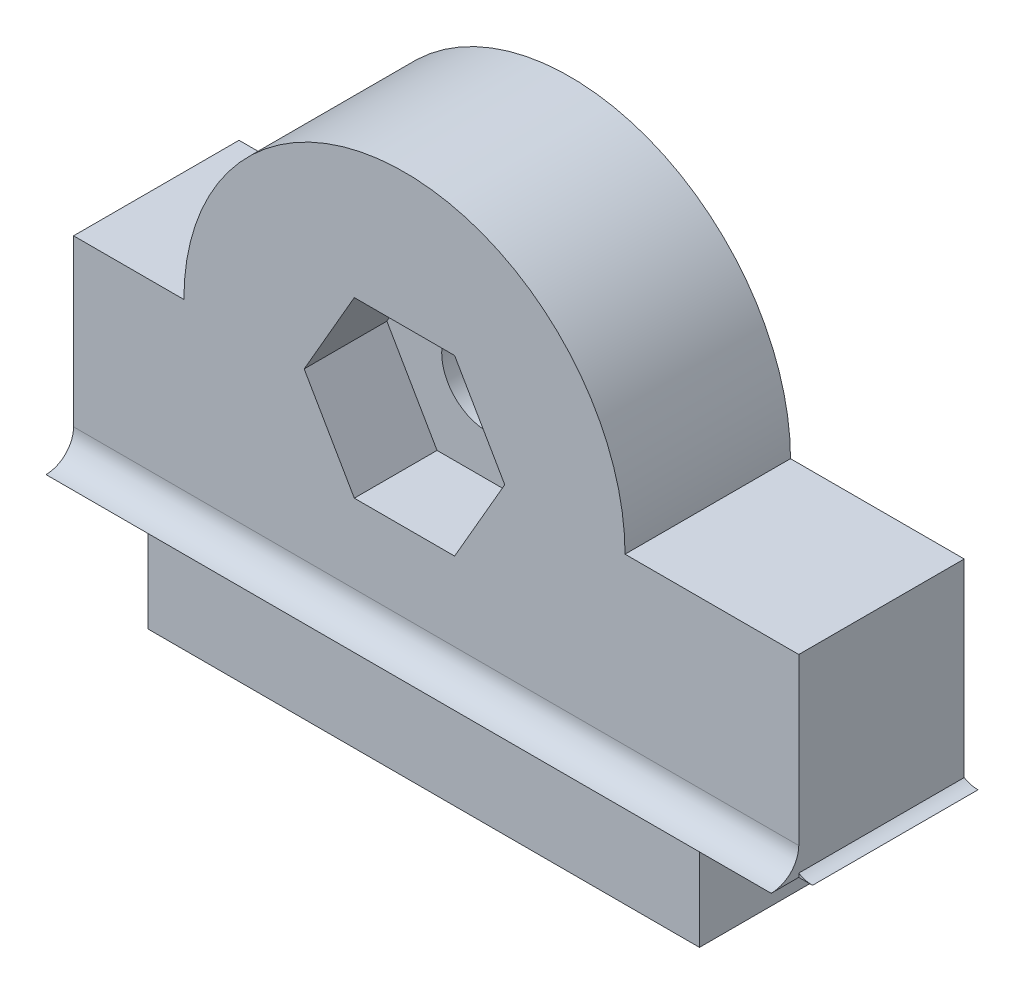
ISO-10303-21;
HEADER;
FILE_DESCRIPTION(('STEP AP214'),'2;1');
FILE_NAME('part.step','',(''),(''),'','','');
FILE_SCHEMA(('AUTOMOTIVE_DESIGN { 1 0 10303 214 1 1 1 1 }'));
ENDSEC;
DATA;
#1=APPLICATION_CONTEXT('core data for automotive mechanical design processes');
#2=APPLICATION_PROTOCOL_DEFINITION('international standard','automotive_design',2000,#1);
#3=PRODUCT_CONTEXT('',#1,'mechanical');
#4=PRODUCT('Part','Part','',(#3));
#5=PRODUCT_RELATED_PRODUCT_CATEGORY('part','',(#4));
#6=PRODUCT_DEFINITION_FORMATION('','',#4);
#7=PRODUCT_DEFINITION_CONTEXT('part definition',#1,'design');
#8=PRODUCT_DEFINITION('design','',#6,#7);
#9=PRODUCT_DEFINITION_SHAPE('','',#8);
#10=(LENGTH_UNIT() NAMED_UNIT(*) SI_UNIT(.MILLI.,.METRE.));
#11=(NAMED_UNIT(*) PLANE_ANGLE_UNIT() SI_UNIT($,.RADIAN.));
#12=(NAMED_UNIT(*) SI_UNIT($,.STERADIAN.) SOLID_ANGLE_UNIT());
#13=UNCERTAINTY_MEASURE_WITH_UNIT(LENGTH_MEASURE(1.E-05),#10,'distance_accuracy_value','');
#14=(GEOMETRIC_REPRESENTATION_CONTEXT(3) GLOBAL_UNCERTAINTY_ASSIGNED_CONTEXT((#13)) GLOBAL_UNIT_ASSIGNED_CONTEXT((#10,
#11,#12)) REPRESENTATION_CONTEXT('',''));
#15=CARTESIAN_POINT('',(0.,0.,0.));
#16=DIRECTION('',(0.,0.,1.));
#17=DIRECTION('',(1.,0.,0.));
#18=AXIS2_PLACEMENT_3D('',#15,#16,#17);
#19=CARTESIAN_POINT('',(12.9373066958946,11.,6.));
#20=DIRECTION('',(-0.866025403784439,-0.5,0.));
#21=DIRECTION('',(0.5,-0.866025403784439,0.));
#22=AXIS2_PLACEMENT_3D('',#19,#20,#21);
#23=PLANE('',#22);
#24=DIRECTION('',(0.,0.,-1.));
#25=VECTOR('',#24,1.);
#26=CARTESIAN_POINT('',(11.1186533479473,14.15,6.));
#27=LINE('',#26,#25);
#28=CARTESIAN_POINT('',(11.1186533479473,14.15,6.));
#29=VERTEX_POINT('',#28);
#30=CARTESIAN_POINT('',(11.1186533479473,14.15,3.));
#31=VERTEX_POINT('',#30);
#32=EDGE_CURVE('E181',#29,#31,#27,.T.);
#33=ORIENTED_EDGE('',*,*,#32,.T.);
#34=DIRECTION('',(0.499999999999999,-0.866025403784439,0.));
#35=VECTOR('',#34,1.);
#36=CARTESIAN_POINT('',(11.1186533479473,14.15,3.));
#37=LINE('',#36,#35);
#38=CARTESIAN_POINT('',(12.9373066958946,11.,3.));
#39=VERTEX_POINT('',#38);
#40=EDGE_CURVE('E170',#31,#39,#37,.T.);
#41=ORIENTED_EDGE('',*,*,#40,.T.);
#42=DIRECTION('',(0.,0.,-1.));
#43=VECTOR('',#42,1.);
#44=CARTESIAN_POINT('',(12.9373066958946,11.,6.));
#45=LINE('',#44,#43);
#46=CARTESIAN_POINT('',(12.9373066958946,11.,6.));
#47=VERTEX_POINT('',#46);
#48=EDGE_CURVE('E286',#47,#39,#45,.T.);
#49=ORIENTED_EDGE('',*,*,#48,.F.);
#50=DIRECTION('',(-0.5,0.866025403784439,0.));
#51=VECTOR('',#50,1.);
#52=CARTESIAN_POINT('',(12.9373066958946,11.,6.));
#53=LINE('',#52,#51);
#54=EDGE_CURVE('E186',#47,#29,#53,.T.);
#55=ORIENTED_EDGE('',*,*,#54,.T.);
#56=EDGE_LOOP('',(#33,#41,#49,#55));
#57=FACE_BOUND('',#56,.T.);
#58=ADVANCED_FACE('F33',(#57),#23,.T.);
#59=CARTESIAN_POINT('',(11.1186533479473,14.15,6.));
#60=DIRECTION('',(0.,-1.,0.));
#61=DIRECTION('',(1.,0.,0.));
#62=AXIS2_PLACEMENT_3D('',#59,#60,#61);
#63=PLANE('',#62);
#64=DIRECTION('',(0.,0.,-1.));
#65=VECTOR('',#64,1.);
#66=CARTESIAN_POINT('',(7.48134665205268,14.15,6.));
#67=LINE('',#66,#65);
#68=CARTESIAN_POINT('',(7.48134665205267,14.15,6.));
#69=VERTEX_POINT('',#68);
#70=CARTESIAN_POINT('',(7.48134665205266,14.15,3.));
#71=VERTEX_POINT('',#70);
#72=EDGE_CURVE('E56',#69,#71,#67,.T.);
#73=ORIENTED_EDGE('',*,*,#72,.T.);
#74=DIRECTION('',(1.,0.,0.));
#75=VECTOR('',#74,1.);
#76=CARTESIAN_POINT('',(7.48134665205266,14.15,3.));
#77=LINE('',#76,#75);
#78=EDGE_CURVE('E173',#71,#31,#77,.T.);
#79=ORIENTED_EDGE('',*,*,#78,.T.);
#80=ORIENTED_EDGE('',*,*,#32,.F.);
#81=DIRECTION('',(-1.,0.,0.));
#82=VECTOR('',#81,1.);
#83=CARTESIAN_POINT('',(11.1186533479473,14.15,6.));
#84=LINE('',#83,#82);
#85=EDGE_CURVE('E319',#29,#69,#84,.T.);
#86=ORIENTED_EDGE('',*,*,#85,.T.);
#87=EDGE_LOOP('',(#73,#79,#80,#86));
#88=FACE_BOUND('',#87,.T.);
#89=ADVANCED_FACE('F180',(#88),#63,.T.);
#90=CARTESIAN_POINT('',(7.48134665205268,14.15,6.));
#91=DIRECTION('',(0.866025403784439,-0.5,0.));
#92=DIRECTION('',(0.5,0.866025403784439,0.));
#93=AXIS2_PLACEMENT_3D('',#90,#91,#92);
#94=PLANE('',#93);
#95=DIRECTION('',(0.,0.,-1.));
#96=VECTOR('',#95,1.);
#97=CARTESIAN_POINT('',(5.66269330410536,11.,6.));
#98=LINE('',#97,#96);
#99=CARTESIAN_POINT('',(5.66269330410534,11.,6.));
#100=VERTEX_POINT('',#99);
#101=CARTESIAN_POINT('',(5.66269330410534,11.,3.));
#102=VERTEX_POINT('',#101);
#103=EDGE_CURVE('E193',#100,#102,#98,.T.);
#104=ORIENTED_EDGE('',*,*,#103,.T.);
#105=DIRECTION('',(0.5,0.866025403784438,0.));
#106=VECTOR('',#105,1.);
#107=CARTESIAN_POINT('',(5.66269330410534,11.,3.));
#108=LINE('',#107,#106);
#109=EDGE_CURVE('E307',#102,#71,#108,.T.);
#110=ORIENTED_EDGE('',*,*,#109,.T.);
#111=ORIENTED_EDGE('',*,*,#72,.F.);
#112=DIRECTION('',(-0.5,-0.866025403784439,0.));
#113=VECTOR('',#112,1.);
#114=CARTESIAN_POINT('',(7.48134665205267,14.15,6.));
#115=LINE('',#114,#113);
#116=EDGE_CURVE('E309',#69,#100,#115,.T.);
#117=ORIENTED_EDGE('',*,*,#116,.T.);
#118=EDGE_LOOP('',(#104,#110,#111,#117));
#119=FACE_BOUND('',#118,.T.);
#120=ADVANCED_FACE('F306',(#119),#94,.T.);
#121=CARTESIAN_POINT('',(5.66269330410536,11.,6.));
#122=DIRECTION('',(0.866025403784438,0.5,0.));
#123=DIRECTION('',(-0.5,0.866025403784439,0.));
#124=AXIS2_PLACEMENT_3D('',#121,#122,#123);
#125=PLANE('',#124);
#126=DIRECTION('',(0.,0.,-1.));
#127=VECTOR('',#126,1.);
#128=CARTESIAN_POINT('',(7.48134665205267,7.85000000000002,6.));
#129=LINE('',#128,#127);
#130=CARTESIAN_POINT('',(7.48134665205267,7.85,6.));
#131=VERTEX_POINT('',#130);
#132=CARTESIAN_POINT('',(7.48134665205266,7.85,3.));
#133=VERTEX_POINT('',#132);
#134=EDGE_CURVE('E303',#131,#133,#129,.T.);
#135=ORIENTED_EDGE('',*,*,#134,.T.);
#136=DIRECTION('',(-0.5,0.866025403784439,0.));
#137=VECTOR('',#136,1.);
#138=CARTESIAN_POINT('',(7.48134665205266,7.85,3.));
#139=LINE('',#138,#137);
#140=EDGE_CURVE('E317',#133,#102,#139,.T.);
#141=ORIENTED_EDGE('',*,*,#140,.T.);
#142=ORIENTED_EDGE('',*,*,#103,.F.);
#143=DIRECTION('',(0.5,-0.866025403784439,0.));
#144=VECTOR('',#143,1.);
#145=CARTESIAN_POINT('',(5.66269330410534,11.,6.));
#146=LINE('',#145,#144);
#147=EDGE_CURVE('E315',#100,#131,#146,.T.);
#148=ORIENTED_EDGE('',*,*,#147,.T.);
#149=EDGE_LOOP('',(#135,#141,#142,#148));
#150=FACE_BOUND('',#149,.T.);
#151=ADVANCED_FACE('F314',(#150),#125,.T.);
#152=CARTESIAN_POINT('',(7.48134665205267,7.85000000000002,6.));
#153=DIRECTION('',(0.,1.,0.));
#154=DIRECTION('',(-1.,0.,0.));
#155=AXIS2_PLACEMENT_3D('',#152,#153,#154);
#156=PLANE('',#155);
#157=DIRECTION('',(0.,0.,-1.));
#158=VECTOR('',#157,1.);
#159=CARTESIAN_POINT('',(11.1186533479473,7.85000000000001,6.));
#160=LINE('',#159,#158);
#161=CARTESIAN_POINT('',(11.1186533479473,7.85,6.));
#162=VERTEX_POINT('',#161);
#163=CARTESIAN_POINT('',(11.1186533479473,7.85000000000001,3.));
#164=VERTEX_POINT('',#163);
#165=EDGE_CURVE('E300',#162,#164,#160,.T.);
#166=ORIENTED_EDGE('',*,*,#165,.T.);
#167=DIRECTION('',(-1.,0.,0.));
#168=VECTOR('',#167,1.);
#169=CARTESIAN_POINT('',(11.1186533479473,7.84999999999999,3.));
#170=LINE('',#169,#168);
#171=EDGE_CURVE('E48',#164,#133,#170,.T.);
#172=ORIENTED_EDGE('',*,*,#171,.T.);
#173=ORIENTED_EDGE('',*,*,#134,.F.);
#174=DIRECTION('',(1.,0.,0.));
#175=VECTOR('',#174,1.);
#176=CARTESIAN_POINT('',(7.48134665205267,7.85,6.));
#177=LINE('',#176,#175);
#178=EDGE_CURVE('E327',#131,#162,#177,.T.);
#179=ORIENTED_EDGE('',*,*,#178,.T.);
#180=EDGE_LOOP('',(#166,#172,#173,#179));
#181=FACE_BOUND('',#180,.T.);
#182=ADVANCED_FACE('F435',(#181),#156,.T.);
#183=CARTESIAN_POINT('',(11.1186533479473,7.85000000000001,6.));
#184=DIRECTION('',(-0.866025403784439,0.5,0.));
#185=DIRECTION('',(-0.5,-0.866025403784439,0.));
#186=AXIS2_PLACEMENT_3D('',#183,#184,#185);
#187=PLANE('',#186);
#188=ORIENTED_EDGE('',*,*,#48,.T.);
#189=DIRECTION('',(-0.5,-0.866025403784438,0.));
#190=VECTOR('',#189,1.);
#191=CARTESIAN_POINT('',(12.9373066958946,11.,3.));
#192=LINE('',#191,#190);
#193=EDGE_CURVE('E174',#39,#164,#192,.T.);
#194=ORIENTED_EDGE('',*,*,#193,.T.);
#195=ORIENTED_EDGE('',*,*,#165,.F.);
#196=DIRECTION('',(0.499999999999999,0.866025403784439,0.));
#197=VECTOR('',#196,1.);
#198=CARTESIAN_POINT('',(11.1186533479473,7.85,6.));
#199=LINE('',#198,#197);
#200=EDGE_CURVE('E330',#162,#47,#199,.T.);
#201=ORIENTED_EDGE('',*,*,#200,.T.);
#202=EDGE_LOOP('',(#188,#194,#195,#201));
#203=FACE_BOUND('',#202,.T.);
#204=ADVANCED_FACE('F432',(#203),#187,.T.);
#205=CARTESIAN_POINT('',(9.29999999999998,11.,6.));
#206=DIRECTION('',(0.,0.,1.));
#207=DIRECTION('',(1.,0.,0.));
#208=AXIS2_PLACEMENT_3D('',#205,#206,#207);
#209=PLANE('',#208);
#210=ORIENTED_EDGE('',*,*,#85,.F.);
#211=ORIENTED_EDGE('',*,*,#54,.F.);
#212=ORIENTED_EDGE('',*,*,#200,.F.);
#213=ORIENTED_EDGE('',*,*,#178,.F.);
#214=ORIENTED_EDGE('',*,*,#147,.F.);
#215=ORIENTED_EDGE('',*,*,#116,.F.);
#216=EDGE_LOOP('',(#210,#211,#212,#213,#214,#215));
#217=FACE_BOUND('',#216,.T.);
#218=DIRECTION('',(0.,-1.,0.));
#219=VECTOR('',#218,1.);
#220=CARTESIAN_POINT('',(-2.7,4.,6.));
#221=LINE('',#220,#219);
#222=CARTESIAN_POINT('',(-2.7,11.,6.));
#223=VERTEX_POINT('',#222);
#224=CARTESIAN_POINT('',(-2.7,5.,6.));
#225=VERTEX_POINT('',#224);
#226=EDGE_CURVE('E213',#223,#225,#221,.T.);
#227=ORIENTED_EDGE('',*,*,#226,.T.);
#228=DIRECTION('',(-1.,0.,0.));
#229=VECTOR('',#228,1.);
#230=CARTESIAN_POINT('',(25.0142135623731,5.,6.));
#231=LINE('',#230,#229);
#232=CARTESIAN_POINT('',(-1.49999999999999,5.,6.));
#233=VERTEX_POINT('',#232);
#234=EDGE_CURVE('E291',#233,#225,#231,.T.);
#235=ORIENTED_EDGE('',*,*,#234,.F.);
#236=CARTESIAN_POINT('',(23.1,5.,6.));
#237=VERTEX_POINT('',#236);
#238=EDGE_CURVE('E289',#237,#233,#231,.T.);
#239=ORIENTED_EDGE('',*,*,#238,.F.);
#240=CARTESIAN_POINT('',(23.6,5.,6.));
#241=VERTEX_POINT('',#240);
#242=EDGE_CURVE('E283',#241,#237,#231,.T.);
#243=ORIENTED_EDGE('',*,*,#242,.F.);
#244=DIRECTION('',(0.,1.,0.));
#245=VECTOR('',#244,1.);
#246=CARTESIAN_POINT('',(23.6,11.,6.));
#247=LINE('',#246,#245);
#248=CARTESIAN_POINT('',(23.6,11.,6.));
#249=VERTEX_POINT('',#248);
#250=EDGE_CURVE('E205',#241,#249,#247,.T.);
#251=ORIENTED_EDGE('',*,*,#250,.T.);
#252=DIRECTION('',(-1.,0.,0.));
#253=VECTOR('',#252,1.);
#254=CARTESIAN_POINT('',(17.3,11.,6.));
#255=LINE('',#254,#253);
#256=CARTESIAN_POINT('',(17.3,11.,6.));
#257=VERTEX_POINT('',#256);
#258=EDGE_CURVE('E207',#249,#257,#255,.T.);
#259=ORIENTED_EDGE('',*,*,#258,.T.);
#260=CARTESIAN_POINT('',(9.29999999999998,11.,6.));
#261=DIRECTION('',(0.,0.,1.));
#262=DIRECTION('',(1.,0.,0.));
#263=AXIS2_PLACEMENT_3D('',#260,#261,#262);
#264=CIRCLE('',#263,8.00000000000001);
#265=CARTESIAN_POINT('',(1.29999999999998,11.,6.));
#266=VERTEX_POINT('',#265);
#267=EDGE_CURVE('E209',#257,#266,#264,.T.);
#268=ORIENTED_EDGE('',*,*,#267,.T.);
#269=DIRECTION('',(-1.,0.,0.));
#270=VECTOR('',#269,1.);
#271=CARTESIAN_POINT('',(-2.7,11.,6.));
#272=LINE('',#271,#270);
#273=EDGE_CURVE('E211',#266,#223,#272,.T.);
#274=ORIENTED_EDGE('',*,*,#273,.T.);
#275=EDGE_LOOP('',(#227,#235,#239,#243,#251,#259,#268,#274));
#276=FACE_BOUND('',#275,.T.);
#277=ADVANCED_FACE('F357',(#217,#276),#209,.T.);
#278=DIRECTION('',(-1.,0.,0.));
#279=VECTOR('',#278,1.);
#280=CARTESIAN_POINT('',(25.0142135623731,4.,6.));
#281=LINE('',#280,#279);
#282=CARTESIAN_POINT('',(20.,4.,6.));
#283=VERTEX_POINT('',#282);
#284=CARTESIAN_POINT('',(0.,4.,6.));
#285=VERTEX_POINT('',#284);
#286=EDGE_CURVE('E280',#283,#285,#281,.T.);
#287=ORIENTED_EDGE('',*,*,#286,.T.);
#288=DIRECTION('',(0.,-1.,0.));
#289=VECTOR('',#288,1.);
#290=CARTESIAN_POINT('',(0.,0.,6.));
#291=LINE('',#290,#289);
#292=CARTESIAN_POINT('',(0.,0.,6.));
#293=VERTEX_POINT('',#292);
#294=EDGE_CURVE('E197',#285,#293,#291,.T.);
#295=ORIENTED_EDGE('',*,*,#294,.T.);
#296=DIRECTION('',(1.,0.,0.));
#297=VECTOR('',#296,1.);
#298=CARTESIAN_POINT('',(0.,0.,6.));
#299=LINE('',#298,#297);
#300=CARTESIAN_POINT('',(20.,0.,6.));
#301=VERTEX_POINT('',#300);
#302=EDGE_CURVE('E200',#293,#301,#299,.T.);
#303=ORIENTED_EDGE('',*,*,#302,.T.);
#304=DIRECTION('',(0.,1.,0.));
#305=VECTOR('',#304,1.);
#306=CARTESIAN_POINT('',(20.,0.,6.));
#307=LINE('',#306,#305);
#308=EDGE_CURVE('E203',#301,#283,#307,.T.);
#309=ORIENTED_EDGE('',*,*,#308,.T.);
#310=EDGE_LOOP('',(#287,#295,#303,#309));
#311=FACE_BOUND('',#310,.T.);
#312=ADVANCED_FACE('F370',(#311),#209,.T.);
#313=CARTESIAN_POINT('',(9.29999999999998,11.,0.));
#314=DIRECTION('',(0.,0.,1.));
#315=DIRECTION('',(1.,0.,0.));
#316=AXIS2_PLACEMENT_3D('',#313,#314,#315);
#317=PLANE('',#316);
#318=DIRECTION('',(0.,-1.,0.));
#319=VECTOR('',#318,1.);
#320=CARTESIAN_POINT('',(0.,0.,0.));
#321=LINE('',#320,#319);
#322=CARTESIAN_POINT('',(0.,4.,0.));
#323=VERTEX_POINT('',#322);
#324=CARTESIAN_POINT('',(0.,0.,0.));
#325=VERTEX_POINT('',#324);
#326=EDGE_CURVE('E188',#323,#325,#321,.T.);
#327=ORIENTED_EDGE('',*,*,#326,.F.);
#328=DIRECTION('',(1.,0.,0.));
#329=VECTOR('',#328,1.);
#330=CARTESIAN_POINT('',(0.,4.,0.));
#331=LINE('',#330,#329);
#332=CARTESIAN_POINT('',(-2.7,4.,0.));
#333=VERTEX_POINT('',#332);
#334=EDGE_CURVE('E201',#333,#323,#331,.T.);
#335=ORIENTED_EDGE('',*,*,#334,.F.);
#336=DIRECTION('',(0.,-1.,0.));
#337=VECTOR('',#336,1.);
#338=CARTESIAN_POINT('',(-2.7,4.,0.));
#339=LINE('',#338,#337);
#340=CARTESIAN_POINT('',(-2.7,11.,0.));
#341=VERTEX_POINT('',#340);
#342=EDGE_CURVE('E230',#341,#333,#339,.T.);
#343=ORIENTED_EDGE('',*,*,#342,.F.);
#344=DIRECTION('',(-1.,0.,0.));
#345=VECTOR('',#344,1.);
#346=CARTESIAN_POINT('',(-2.7,11.,0.));
#347=LINE('',#346,#345);
#348=CARTESIAN_POINT('',(1.29999999999998,11.,0.));
#349=VERTEX_POINT('',#348);
#350=EDGE_CURVE('E228',#349,#341,#347,.T.);
#351=ORIENTED_EDGE('',*,*,#350,.F.);
#352=CARTESIAN_POINT('',(9.29999999999998,11.,0.));
#353=DIRECTION('',(0.,0.,1.));
#354=DIRECTION('',(1.,0.,0.));
#355=AXIS2_PLACEMENT_3D('',#352,#353,#354);
#356=CIRCLE('',#355,8.00000000000001);
#357=CARTESIAN_POINT('',(17.3,11.,0.));
#358=VERTEX_POINT('',#357);
#359=EDGE_CURVE('E226',#358,#349,#356,.T.);
#360=ORIENTED_EDGE('',*,*,#359,.F.);
#361=DIRECTION('',(-1.,0.,0.));
#362=VECTOR('',#361,1.);
#363=CARTESIAN_POINT('',(17.3,11.,0.));
#364=LINE('',#363,#362);
#365=CARTESIAN_POINT('',(23.6,11.,0.));
#366=VERTEX_POINT('',#365);
#367=EDGE_CURVE('E224',#366,#358,#364,.T.);
#368=ORIENTED_EDGE('',*,*,#367,.F.);
#369=DIRECTION('',(0.,1.,0.));
#370=VECTOR('',#369,1.);
#371=CARTESIAN_POINT('',(23.6,11.,0.));
#372=LINE('',#371,#370);
#373=CARTESIAN_POINT('',(23.6,4.13397459621556,0.));
#374=VERTEX_POINT('',#373);
#375=EDGE_CURVE('E222',#374,#366,#372,.T.);
#376=ORIENTED_EDGE('',*,*,#375,.F.);
#377=CARTESIAN_POINT('',(24.1,5.,0.));
#378=DIRECTION('',(0.,0.,1.));
#379=DIRECTION('',(1.,0.,0.));
#380=AXIS2_PLACEMENT_3D('',#377,#378,#379);
#381=CIRCLE('',#380,1.);
#382=CARTESIAN_POINT('',(24.1,4.,0.));
#383=VERTEX_POINT('',#382);
#384=EDGE_CURVE('E269',#374,#383,#381,.T.);
#385=ORIENTED_EDGE('',*,*,#384,.T.);
#386=DIRECTION('',(1.,0.,0.));
#387=VECTOR('',#386,1.);
#388=CARTESIAN_POINT('',(23.6,4.,0.));
#389=LINE('',#388,#387);
#390=CARTESIAN_POINT('',(20.,4.,0.));
#391=VERTEX_POINT('',#390);
#392=EDGE_CURVE('E220',#391,#383,#389,.T.);
#393=ORIENTED_EDGE('',*,*,#392,.F.);
#394=DIRECTION('',(0.,1.,0.));
#395=VECTOR('',#394,1.);
#396=CARTESIAN_POINT('',(20.,0.,0.));
#397=LINE('',#396,#395);
#398=CARTESIAN_POINT('',(20.,0.,0.));
#399=VERTEX_POINT('',#398);
#400=EDGE_CURVE('E218',#399,#391,#397,.T.);
#401=ORIENTED_EDGE('',*,*,#400,.F.);
#402=DIRECTION('',(1.,0.,0.));
#403=VECTOR('',#402,1.);
#404=CARTESIAN_POINT('',(0.,0.,0.));
#405=LINE('',#404,#403);
#406=EDGE_CURVE('E191',#325,#399,#405,.T.);
#407=ORIENTED_EDGE('',*,*,#406,.F.);
#408=EDGE_LOOP('',(#327,#335,#343,#351,#360,#368,#376,#385,#393,#401,#407));
#409=FACE_BOUND('',#408,.T.);
#410=CARTESIAN_POINT('',(9.29999999999998,11.,0.));
#411=DIRECTION('',(0.,0.,-1.));
#412=DIRECTION('',(-1.,0.,0.));
#413=AXIS2_PLACEMENT_3D('',#410,#411,#412);
#414=CIRCLE('',#413,1.65);
#415=CARTESIAN_POINT('',(7.64999999999999,11.,0.));
#416=VERTEX_POINT('',#415);
#417=EDGE_CURVE('E620',#416,#416,#414,.T.);
#418=ORIENTED_EDGE('',*,*,#417,.F.);
#419=EDGE_LOOP('',(#418));
#420=FACE_BOUND('',#419,.T.);
#421=ADVANCED_FACE('F265',(#409,#420),#317,.F.);
#422=CARTESIAN_POINT('',(0.,0.,6.));
#423=DIRECTION('',(1.,0.,0.));
#424=DIRECTION('',(0.,0.,-1.));
#425=AXIS2_PLACEMENT_3D('',#422,#423,#424);
#426=PLANE('',#425);
#427=ORIENTED_EDGE('',*,*,#326,.T.);
#428=DIRECTION('',(0.,0.,-1.));
#429=VECTOR('',#428,1.);
#430=CARTESIAN_POINT('',(0.,0.,6.));
#431=LINE('',#430,#429);
#432=EDGE_CURVE('E11',#293,#325,#431,.T.);
#433=ORIENTED_EDGE('',*,*,#432,.F.);
#434=ORIENTED_EDGE('',*,*,#294,.F.);
#435=DIRECTION('',(0.,0.,-1.));
#436=VECTOR('',#435,1.);
#437=CARTESIAN_POINT('',(0.,4.,6.));
#438=LINE('',#437,#436);
#439=EDGE_CURVE('E215',#285,#323,#438,.T.);
#440=ORIENTED_EDGE('',*,*,#439,.T.);
#441=EDGE_LOOP('',(#427,#433,#434,#440));
#442=FACE_BOUND('',#441,.T.);
#443=ADVANCED_FACE('F35',(#442),#426,.F.);
#444=CARTESIAN_POINT('',(0.,0.,6.));
#445=DIRECTION('',(0.,1.,0.));
#446=DIRECTION('',(0.,0.,1.));
#447=AXIS2_PLACEMENT_3D('',#444,#445,#446);
#448=PLANE('',#447);
#449=ORIENTED_EDGE('',*,*,#406,.T.);
#450=DIRECTION('',(0.,0.,-1.));
#451=VECTOR('',#450,1.);
#452=CARTESIAN_POINT('',(20.,0.,6.));
#453=LINE('',#452,#451);
#454=EDGE_CURVE('E41',#301,#399,#453,.T.);
#455=ORIENTED_EDGE('',*,*,#454,.F.);
#456=ORIENTED_EDGE('',*,*,#302,.F.);
#457=ORIENTED_EDGE('',*,*,#432,.T.);
#458=EDGE_LOOP('',(#449,#455,#456,#457));
#459=FACE_BOUND('',#458,.T.);
#460=ADVANCED_FACE('F371',(#459),#448,.F.);
#461=CARTESIAN_POINT('',(20.,0.,6.));
#462=DIRECTION('',(-1.,0.,0.));
#463=DIRECTION('',(0.,0.,1.));
#464=AXIS2_PLACEMENT_3D('',#461,#462,#463);
#465=PLANE('',#464);
#466=ORIENTED_EDGE('',*,*,#400,.T.);
#467=DIRECTION('',(0.,0.,-1.));
#468=VECTOR('',#467,1.);
#469=CARTESIAN_POINT('',(20.,4.,6.));
#470=LINE('',#469,#468);
#471=EDGE_CURVE('E252',#283,#391,#470,.T.);
#472=ORIENTED_EDGE('',*,*,#471,.F.);
#473=ORIENTED_EDGE('',*,*,#308,.F.);
#474=ORIENTED_EDGE('',*,*,#454,.T.);
#475=EDGE_LOOP('',(#466,#472,#473,#474));
#476=FACE_BOUND('',#475,.T.);
#477=ADVANCED_FACE('F259',(#476),#465,.F.);
#478=CARTESIAN_POINT('',(23.6,11.,6.));
#479=DIRECTION('',(-1.,0.,0.));
#480=DIRECTION('',(0.,-1.,0.));
#481=AXIS2_PLACEMENT_3D('',#478,#479,#480);
#482=PLANE('',#481);
#483=DIRECTION('',(0.,1.,0.));
#484=VECTOR('',#483,1.);
#485=CARTESIAN_POINT('',(23.6,11.,6.));
#486=LINE('',#485,#484);
#487=CARTESIAN_POINT('',(23.6,4.,6.));
#488=VERTEX_POINT('',#487);
#489=CARTESIAN_POINT('',(23.6,4.13397459621556,6.));
#490=VERTEX_POINT('',#489);
#491=EDGE_CURVE('E341',#488,#490,#486,.T.);
#492=ORIENTED_EDGE('',*,*,#491,.T.);
#493=DIRECTION('',(0.,0.,1.));
#494=VECTOR('',#493,1.);
#495=CARTESIAN_POINT('',(23.6,4.13397459621556,-1.4142135623731));
#496=LINE('',#495,#494);
#497=EDGE_CURVE('E342',#490,#374,#496,.F.);
#498=ORIENTED_EDGE('',*,*,#497,.T.);
#499=ORIENTED_EDGE('',*,*,#375,.T.);
#500=DIRECTION('',(0.,0.,-1.));
#501=VECTOR('',#500,1.);
#502=CARTESIAN_POINT('',(23.6,11.,6.));
#503=LINE('',#502,#501);
#504=EDGE_CURVE('E247',#249,#366,#503,.T.);
#505=ORIENTED_EDGE('',*,*,#504,.F.);
#506=ORIENTED_EDGE('',*,*,#250,.F.);
#507=CARTESIAN_POINT('',(23.6,5.,7.));
#508=DIRECTION('',(-1.,0.,0.));
#509=DIRECTION('',(0.,-1.,0.));
#510=AXIS2_PLACEMENT_3D('',#507,#508,#509);
#511=CIRCLE('',#510,1.);
#512=CARTESIAN_POINT('',(23.6,4.,7.));
#513=VERTEX_POINT('',#512);
#514=EDGE_CURVE('E282',#241,#513,#511,.T.);
#515=ORIENTED_EDGE('',*,*,#514,.T.);
#516=DIRECTION('',(0.,0.,-1.));
#517=VECTOR('',#516,1.);
#518=CARTESIAN_POINT('',(23.6,4.,6.));
#519=LINE('',#518,#517);
#520=EDGE_CURVE('E250',#513,#488,#519,.T.);
#521=ORIENTED_EDGE('',*,*,#520,.T.);
#522=EDGE_LOOP('',(#492,#498,#499,#505,#506,#515,#521));
#523=FACE_BOUND('',#522,.T.);
#524=ADVANCED_FACE('F377',(#523),#482,.F.);
#525=CARTESIAN_POINT('',(17.3,11.,6.));
#526=DIRECTION('',(0.,-1.,0.));
#527=DIRECTION('',(0.,0.,-1.));
#528=AXIS2_PLACEMENT_3D('',#525,#526,#527);
#529=PLANE('',#528);
#530=ORIENTED_EDGE('',*,*,#367,.T.);
#531=DIRECTION('',(0.,0.,-1.));
#532=VECTOR('',#531,1.);
#533=CARTESIAN_POINT('',(17.3,11.,6.));
#534=LINE('',#533,#532);
#535=EDGE_CURVE('E244',#257,#358,#534,.T.);
#536=ORIENTED_EDGE('',*,*,#535,.F.);
#537=ORIENTED_EDGE('',*,*,#258,.F.);
#538=ORIENTED_EDGE('',*,*,#504,.T.);
#539=EDGE_LOOP('',(#530,#536,#537,#538));
#540=FACE_BOUND('',#539,.T.);
#541=ADVANCED_FACE('F401',(#540),#529,.F.);
#542=CARTESIAN_POINT('',(9.29999999999998,11.,6.));
#543=DIRECTION('',(0.,0.,-1.));
#544=DIRECTION('',(-1.,0.,0.));
#545=AXIS2_PLACEMENT_3D('',#542,#543,#544);
#546=CYLINDRICAL_SURFACE('',#545,8.00000000000001);
#547=ORIENTED_EDGE('',*,*,#359,.T.);
#548=DIRECTION('',(0.,0.,-1.));
#549=VECTOR('',#548,1.);
#550=CARTESIAN_POINT('',(1.29999999999998,11.,6.));
#551=LINE('',#550,#549);
#552=EDGE_CURVE('E241',#266,#349,#551,.T.);
#553=ORIENTED_EDGE('',*,*,#552,.F.);
#554=ORIENTED_EDGE('',*,*,#267,.F.);
#555=ORIENTED_EDGE('',*,*,#535,.T.);
#556=EDGE_LOOP('',(#547,#553,#554,#555));
#557=FACE_BOUND('',#556,.T.);
#558=ADVANCED_FACE('F398',(#557),#546,.T.);
#559=CARTESIAN_POINT('',(-2.7,11.,6.));
#560=DIRECTION('',(0.,-1.,0.));
#561=DIRECTION('',(0.,0.,-1.));
#562=AXIS2_PLACEMENT_3D('',#559,#560,#561);
#563=PLANE('',#562);
#564=ORIENTED_EDGE('',*,*,#350,.T.);
#565=DIRECTION('',(0.,0.,-1.));
#566=VECTOR('',#565,1.);
#567=CARTESIAN_POINT('',(-2.7,11.,6.));
#568=LINE('',#567,#566);
#569=EDGE_CURVE('E238',#223,#341,#568,.T.);
#570=ORIENTED_EDGE('',*,*,#569,.F.);
#571=ORIENTED_EDGE('',*,*,#273,.F.);
#572=ORIENTED_EDGE('',*,*,#552,.T.);
#573=EDGE_LOOP('',(#564,#570,#571,#572));
#574=FACE_BOUND('',#573,.T.);
#575=ADVANCED_FACE('F363',(#574),#563,.F.);
#576=CARTESIAN_POINT('',(-2.7,4.,6.));
#577=DIRECTION('',(1.,0.,0.));
#578=DIRECTION('',(0.,1.,0.));
#579=AXIS2_PLACEMENT_3D('',#576,#577,#578);
#580=PLANE('',#579);
#581=ORIENTED_EDGE('',*,*,#342,.T.);
#582=DIRECTION('',(0.,0.,-1.));
#583=VECTOR('',#582,1.);
#584=CARTESIAN_POINT('',(-2.7,4.,6.));
#585=LINE('',#584,#583);
#586=CARTESIAN_POINT('',(-2.7,4.,7.));
#587=VERTEX_POINT('',#586);
#588=EDGE_CURVE('E235',#587,#333,#585,.T.);
#589=ORIENTED_EDGE('',*,*,#588,.F.);
#590=CARTESIAN_POINT('',(-2.7,5.,7.));
#591=DIRECTION('',(1.,0.,0.));
#592=DIRECTION('',(0.,0.,1.));
#593=AXIS2_PLACEMENT_3D('',#590,#591,#592);
#594=CIRCLE('',#593,1.);
#595=EDGE_CURVE('E293',#587,#225,#594,.T.);
#596=ORIENTED_EDGE('',*,*,#595,.T.);
#597=ORIENTED_EDGE('',*,*,#226,.F.);
#598=ORIENTED_EDGE('',*,*,#569,.T.);
#599=EDGE_LOOP('',(#581,#589,#596,#597,#598));
#600=FACE_BOUND('',#599,.T.);
#601=ADVANCED_FACE('F350',(#600),#580,.F.);
#602=CARTESIAN_POINT('',(0.,4.,6.));
#603=DIRECTION('',(0.,1.,0.));
#604=DIRECTION('',(0.,0.,1.));
#605=AXIS2_PLACEMENT_3D('',#602,#603,#604);
#606=PLANE('',#605);
#607=ORIENTED_EDGE('',*,*,#334,.T.);
#608=ORIENTED_EDGE('',*,*,#439,.F.);
#609=ORIENTED_EDGE('',*,*,#286,.F.);
#610=ORIENTED_EDGE('',*,*,#471,.T.);
#611=ORIENTED_EDGE('',*,*,#392,.T.);
#612=DIRECTION('',(0.,0.,1.));
#613=VECTOR('',#612,1.);
#614=CARTESIAN_POINT('',(24.1,4.,-1.4142135623731));
#615=LINE('',#614,#613);
#616=CARTESIAN_POINT('',(24.1,4.,6.));
#617=VERTEX_POINT('',#616);
#618=EDGE_CURVE('E275',#383,#617,#615,.T.);
#619=ORIENTED_EDGE('',*,*,#618,.T.);
#620=DIRECTION('',(1.,0.,0.));
#621=VECTOR('',#620,1.);
#622=CARTESIAN_POINT('',(23.1,4.,6.));
#623=LINE('',#622,#621);
#624=EDGE_CURVE('E334',#488,#617,#623,.T.);
#625=ORIENTED_EDGE('',*,*,#624,.F.);
#626=ORIENTED_EDGE('',*,*,#520,.F.);
#627=DIRECTION('',(-1.,0.,0.));
#628=VECTOR('',#627,1.);
#629=CARTESIAN_POINT('',(25.0142135623731,4.,7.));
#630=LINE('',#629,#628);
#631=EDGE_CURVE('E296',#513,#587,#630,.T.);
#632=ORIENTED_EDGE('',*,*,#631,.T.);
#633=ORIENTED_EDGE('',*,*,#588,.T.);
#634=EDGE_LOOP('',(#607,#608,#609,#610,#611,#619,#625,#626,#632,#633));
#635=FACE_BOUND('',#634,.T.);
#636=ADVANCED_FACE('F273',(#635),#606,.F.);
#637=CARTESIAN_POINT('',(25.0142135623731,5.,7.));
#638=DIRECTION('',(-1.,0.,0.));
#639=DIRECTION('',(0.,0.,1.));
#640=AXIS2_PLACEMENT_3D('',#637,#638,#639);
#641=CYLINDRICAL_SURFACE('',#640,1.);
#642=ORIENTED_EDGE('',*,*,#514,.F.);
#643=ORIENTED_EDGE('',*,*,#242,.T.);
#644=ORIENTED_EDGE('',*,*,#238,.T.);
#645=ORIENTED_EDGE('',*,*,#234,.T.);
#646=ORIENTED_EDGE('',*,*,#595,.F.);
#647=ORIENTED_EDGE('',*,*,#631,.F.);
#648=EDGE_LOOP('',(#642,#643,#644,#645,#646,#647));
#649=FACE_BOUND('',#648,.T.);
#650=ADVANCED_FACE('F354',(#649),#641,.F.);
#651=CARTESIAN_POINT('',(24.1,5.,-1.4142135623731));
#652=DIRECTION('',(0.,0.,1.));
#653=DIRECTION('',(1.,0.,0.));
#654=AXIS2_PLACEMENT_3D('',#651,#652,#653);
#655=CYLINDRICAL_SURFACE('',#654,1.);
#656=ORIENTED_EDGE('',*,*,#497,.F.);
#657=CARTESIAN_POINT('',(24.1,5.,6.));
#658=DIRECTION('',(0.,0.,-1.));
#659=DIRECTION('',(1.,0.,0.));
#660=AXIS2_PLACEMENT_3D('',#657,#658,#659);
#661=CIRCLE('',#660,1.);
#662=EDGE_CURVE('E336',#617,#490,#661,.T.);
#663=ORIENTED_EDGE('',*,*,#662,.F.);
#664=ORIENTED_EDGE('',*,*,#618,.F.);
#665=ORIENTED_EDGE('',*,*,#384,.F.);
#666=EDGE_LOOP('',(#656,#663,#664,#665));
#667=FACE_BOUND('',#666,.T.);
#668=ADVANCED_FACE('F412',(#667),#655,.F.);
#669=CARTESIAN_POINT('',(24.1,5.,6.));
#670=DIRECTION('',(0.,0.,1.));
#671=DIRECTION('',(1.,0.,0.));
#672=AXIS2_PLACEMENT_3D('',#669,#670,#671);
#673=PLANE('',#672);
#674=ORIENTED_EDGE('',*,*,#491,.F.);
#675=ORIENTED_EDGE('',*,*,#624,.T.);
#676=ORIENTED_EDGE('',*,*,#662,.T.);
#677=EDGE_LOOP('',(#674,#675,#676));
#678=FACE_BOUND('',#677,.T.);
#679=ADVANCED_FACE('F413',(#678),#673,.T.);
#680=CARTESIAN_POINT('',(0.,0.,3.));
#681=DIRECTION('',(0.,0.,-1.));
#682=DIRECTION('',(-1.,0.,0.));
#683=AXIS2_PLACEMENT_3D('',#680,#681,#682);
#684=PLANE('',#683);
#685=CARTESIAN_POINT('',(9.29999999999998,11.,3.));
#686=DIRECTION('',(0.,0.,-1.));
#687=DIRECTION('',(-1.,0.,0.));
#688=AXIS2_PLACEMENT_3D('',#685,#686,#687);
#689=CIRCLE('',#688,1.65);
#690=CARTESIAN_POINT('',(7.64999999999999,11.,3.));
#691=VERTEX_POINT('',#690);
#692=EDGE_CURVE('E183',#691,#691,#689,.T.);
#693=ORIENTED_EDGE('',*,*,#692,.T.);
#694=EDGE_LOOP('',(#693));
#695=FACE_BOUND('',#694,.T.);
#696=ORIENTED_EDGE('',*,*,#78,.F.);
#697=ORIENTED_EDGE('',*,*,#109,.F.);
#698=ORIENTED_EDGE('',*,*,#140,.F.);
#699=ORIENTED_EDGE('',*,*,#171,.F.);
#700=ORIENTED_EDGE('',*,*,#193,.F.);
#701=ORIENTED_EDGE('',*,*,#40,.F.);
#702=EDGE_LOOP('',(#696,#697,#698,#699,#700,#701));
#703=FACE_BOUND('',#702,.T.);
#704=ADVANCED_FACE('F172',(#695,#703),#684,.F.);
#705=CARTESIAN_POINT('',(9.29999999999998,11.,3.));
#706=DIRECTION('',(0.,0.,-1.));
#707=DIRECTION('',(-1.,0.,0.));
#708=AXIS2_PLACEMENT_3D('',#705,#706,#707);
#709=CYLINDRICAL_SURFACE('',#708,1.65);
#710=ORIENTED_EDGE('',*,*,#692,.F.);
#711=EDGE_LOOP('',(#710));
#712=FACE_BOUND('',#711,.T.);
#713=ORIENTED_EDGE('',*,*,#417,.T.);
#714=EDGE_LOOP('',(#713));
#715=FACE_BOUND('',#714,.T.);
#716=ADVANCED_FACE('F424',(#712,#715),#709,.F.);
#717=CLOSED_SHELL('',(#58,#89,#120,#151,#182,#204,#277,#312,#421,#443,#460,#477,#524,#541,#558,
#575,#601,#636,#650,#668,#679,#704,#716));
#718=MANIFOLD_SOLID_BREP('B2',#717);
#719=ADVANCED_BREP_SHAPE_REPRESENTATION('',(#18,#718),#14);
#720=SHAPE_DEFINITION_REPRESENTATION(#9,#719);
ENDSEC;
END-ISO-10303-21;
